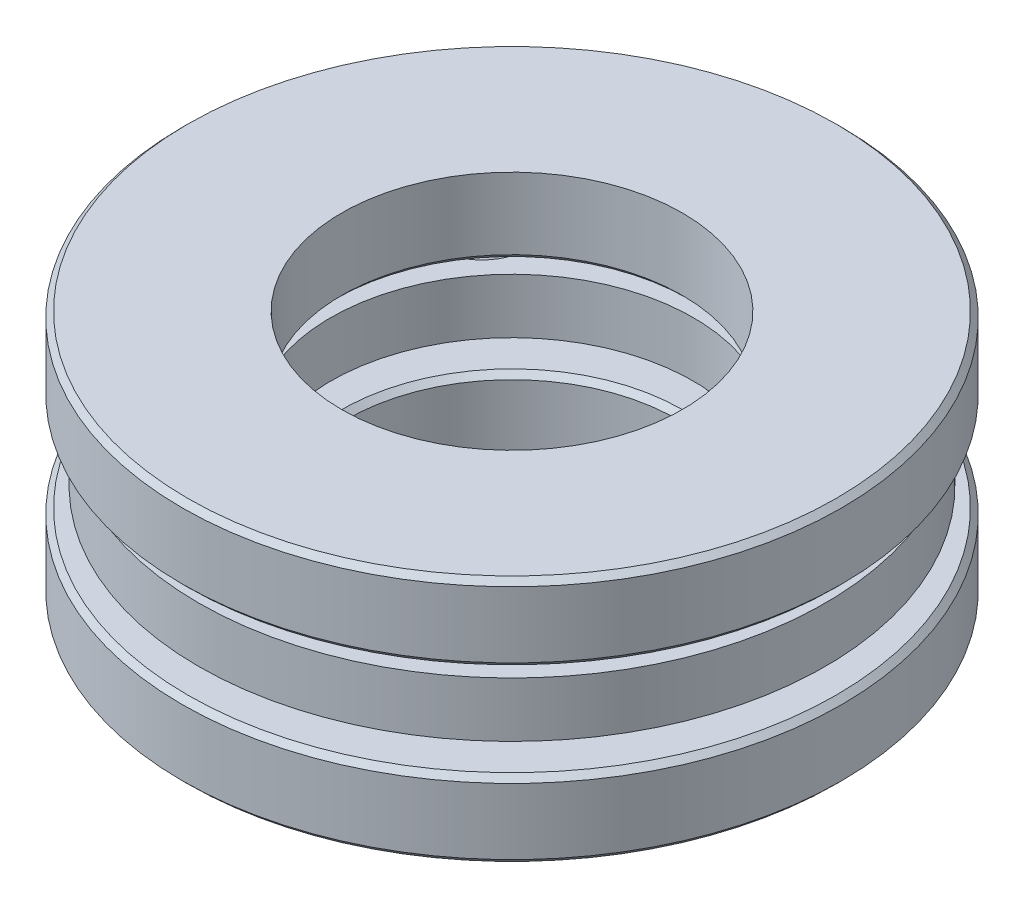
ISO-10303-21;
HEADER;
FILE_DESCRIPTION(('STEP AP214'),'2;1');
FILE_NAME('part.step','',(''),(''),'','','');
FILE_SCHEMA(('AUTOMOTIVE_DESIGN { 1 0 10303 214 1 1 1 1 }'));
ENDSEC;
DATA;
#1=APPLICATION_CONTEXT('core data for automotive mechanical design processes');
#2=APPLICATION_PROTOCOL_DEFINITION('international standard','automotive_design',2000,#1);
#3=PRODUCT_CONTEXT('',#1,'mechanical');
#4=PRODUCT('Part','Part','',(#3));
#5=PRODUCT_RELATED_PRODUCT_CATEGORY('part','',(#4));
#6=PRODUCT_DEFINITION_FORMATION('','',#4);
#7=PRODUCT_DEFINITION_CONTEXT('part definition',#1,'design');
#8=PRODUCT_DEFINITION('design','',#6,#7);
#9=PRODUCT_DEFINITION_SHAPE('','',#8);
#10=(LENGTH_UNIT() NAMED_UNIT(*) SI_UNIT(.MILLI.,.METRE.));
#11=(NAMED_UNIT(*) PLANE_ANGLE_UNIT() SI_UNIT($,.RADIAN.));
#12=(NAMED_UNIT(*) SI_UNIT($,.STERADIAN.) SOLID_ANGLE_UNIT());
#13=UNCERTAINTY_MEASURE_WITH_UNIT(LENGTH_MEASURE(1.E-05),#10,'distance_accuracy_value','');
#14=(GEOMETRIC_REPRESENTATION_CONTEXT(3) GLOBAL_UNCERTAINTY_ASSIGNED_CONTEXT((#13)) GLOBAL_UNIT_ASSIGNED_CONTEXT((#10,
#11,#12)) REPRESENTATION_CONTEXT('',''));
#15=CARTESIAN_POINT('',(0.,0.,0.));
#16=DIRECTION('',(0.,0.,1.));
#17=DIRECTION('',(1.,0.,0.));
#18=AXIS2_PLACEMENT_3D('',#15,#16,#17);
#19=CARTESIAN_POINT('',(-3.4471999940354,2.25,-2.89254424358943));
#20=DIRECTION('',(0.64278760968654,0.,-0.766044443118978));
#21=DIRECTION('',(-0.766044443118978,0.,-0.64278760968654));
#22=AXIS2_PLACEMENT_3D('',#19,#20,#21);
#23=SPHERICAL_SURFACE('',#22,1.);
#24=CARTESIAN_POINT('',(-3.4471999940354,2.25,-2.89254424358943));
#25=DIRECTION('',(0.,1.,0.));
#26=DIRECTION('',(-0.64278760968654,0.,0.766044443118977));
#27=AXIS2_PLACEMENT_3D('',#24,#25,#26);
#28=SPHERICAL_SURFACE('',#27,1.);
#29=CARTESIAN_POINT('',(-3.4471999940354,2.75,-2.89254424358943));
#30=DIRECTION('',(0.,1.,0.));
#31=DIRECTION('',(-0.642787609686541,0.,0.766044443118977));
#32=AXIS2_PLACEMENT_3D('',#29,#30,#31);
#33=CIRCLE('',#32,0.866025403784439);
#34=CARTESIAN_POINT('',(-4.00387039326182,2.75,-2.22913029542049));
#35=VERTEX_POINT('',#34);
#36=EDGE_CURVE('E91',#35,#35,#33,.T.);
#37=ORIENTED_EDGE('',*,*,#36,.T.);
#38=EDGE_LOOP('',(#37));
#39=FACE_BOUND('',#38,.T.);
#40=CARTESIAN_POINT('',(-3.4471999940354,3.1,-2.89254424358943));
#41=DIRECTION('',(0.,1.,0.));
#42=DIRECTION('',(0.,0.,1.));
#43=AXIS2_PLACEMENT_3D('',#40,#41,#42);
#44=CIRCLE('',#43,0.526782687642638);
#45=CARTESIAN_POINT('',(-3.4471999940354,3.1,-2.36576155594679));
#46=VERTEX_POINT('',#45);
#47=EDGE_CURVE('E145',#46,#46,#44,.T.);
#48=ORIENTED_EDGE('',*,*,#47,.F.);
#49=EDGE_LOOP('',(#48));
#50=FACE_BOUND('',#49,.T.);
#51=ADVANCED_FACE('F32',(#39,#50),#28,.T.);
#52=CARTESIAN_POINT('',(-0.781416799501173,2.25,-4.43163488855494));
#53=DIRECTION('',(0.984807753012208,0.,-0.173648177666928));
#54=DIRECTION('',(-0.173648177666928,0.,-0.984807753012208));
#55=AXIS2_PLACEMENT_3D('',#52,#53,#54);
#56=SPHERICAL_SURFACE('',#55,1.);
#57=CARTESIAN_POINT('',(-0.781416799501173,2.25,-4.43163488855494));
#58=DIRECTION('',(0.,1.,0.));
#59=DIRECTION('',(-0.984807753012209,0.,0.173648177666927));
#60=AXIS2_PLACEMENT_3D('',#57,#58,#59);
#61=SPHERICAL_SURFACE('',#60,1.);
#62=CARTESIAN_POINT('',(-0.781416799501173,2.75,-4.43163488855494));
#63=DIRECTION('',(0.,1.,0.));
#64=DIRECTION('',(-0.984807753012209,0.,0.173648177666927));
#65=AXIS2_PLACEMENT_3D('',#62,#63,#64);
#66=CIRCLE('',#65,0.866025403784439);
#67=CARTESIAN_POINT('',(-1.63428533145362,2.75,-4.28125115537451));
#68=VERTEX_POINT('',#67);
#69=EDGE_CURVE('E94',#68,#68,#66,.T.);
#70=ORIENTED_EDGE('',*,*,#69,.T.);
#71=EDGE_LOOP('',(#70));
#72=FACE_BOUND('',#71,.T.);
#73=CARTESIAN_POINT('',(-0.781416799501173,3.1,-4.43163488855494));
#74=DIRECTION('',(0.,1.,0.));
#75=DIRECTION('',(0.,0.,1.));
#76=AXIS2_PLACEMENT_3D('',#73,#74,#75);
#77=CIRCLE('',#76,0.526782687642638);
#78=CARTESIAN_POINT('',(-0.781416799501173,3.1,-3.9048522009123));
#79=VERTEX_POINT('',#78);
#80=EDGE_CURVE('E148',#79,#79,#77,.T.);
#81=ORIENTED_EDGE('',*,*,#80,.F.);
#82=EDGE_LOOP('',(#81));
#83=FACE_BOUND('',#82,.T.);
#84=ADVANCED_FACE('F223',(#72,#83),#61,.T.);
#85=CARTESIAN_POINT('',(2.25000000000002,2.25,-3.89711431702996));
#86=DIRECTION('',(0.866025403784437,0.,0.500000000000004));
#87=DIRECTION('',(0.500000000000004,0.,-0.866025403784437));
#88=AXIS2_PLACEMENT_3D('',#85,#86,#87);
#89=SPHERICAL_SURFACE('',#88,1.);
#90=CARTESIAN_POINT('',(2.25000000000002,2.25,-3.89711431702996));
#91=DIRECTION('',(0.,1.,0.));
#92=DIRECTION('',(-0.866025403784436,0.,-0.500000000000004));
#93=AXIS2_PLACEMENT_3D('',#90,#91,#92);
#94=SPHERICAL_SURFACE('',#93,1.);
#95=CARTESIAN_POINT('',(2.25000000000002,2.75,-3.89711431702996));
#96=DIRECTION('',(0.,1.,0.));
#97=DIRECTION('',(-0.866025403784436,0.,-0.500000000000004));
#98=AXIS2_PLACEMENT_3D('',#95,#96,#97);
#99=CIRCLE('',#98,0.866025403784439);
#100=CARTESIAN_POINT('',(1.50000000000002,2.75,-4.33012701892219));
#101=VERTEX_POINT('',#100);
#102=EDGE_CURVE('E102',#101,#101,#99,.T.);
#103=ORIENTED_EDGE('',*,*,#102,.T.);
#104=EDGE_LOOP('',(#103));
#105=FACE_BOUND('',#104,.T.);
#106=CARTESIAN_POINT('',(2.25000000000002,3.1,-3.89711431702996));
#107=DIRECTION('',(0.,1.,0.));
#108=DIRECTION('',(0.,0.,1.));
#109=AXIS2_PLACEMENT_3D('',#106,#107,#108);
#110=CIRCLE('',#109,0.526782687642638);
#111=CARTESIAN_POINT('',(2.25000000000002,3.1,-3.37033162938733));
#112=VERTEX_POINT('',#111);
#113=EDGE_CURVE('E151',#112,#112,#110,.T.);
#114=ORIENTED_EDGE('',*,*,#113,.F.);
#115=EDGE_LOOP('',(#114));
#116=FACE_BOUND('',#115,.T.);
#117=ADVANCED_FACE('F230',(#105,#116),#94,.T.);
#118=CARTESIAN_POINT('',(4.2286167935366,2.25,-1.53909064496548));
#119=DIRECTION('',(0.342020143325663,0.,0.939692620785911));
#120=DIRECTION('',(0.939692620785911,0.,-0.342020143325663));
#121=AXIS2_PLACEMENT_3D('',#118,#119,#120);
#122=SPHERICAL_SURFACE('',#121,1.);
#123=CARTESIAN_POINT('',(4.2286167935366,2.25,-1.53909064496548));
#124=DIRECTION('',(0.,1.,0.));
#125=DIRECTION('',(-0.342020143325663,0.,-0.93969262078591));
#126=AXIS2_PLACEMENT_3D('',#123,#124,#125);
#127=SPHERICAL_SURFACE('',#126,1.);
#128=CARTESIAN_POINT('',(4.2286167935366,2.75,-1.53909064496548));
#129=DIRECTION('',(0.,1.,0.));
#130=DIRECTION('',(-0.342020143325663,0.,-0.939692620785911));
#131=AXIS2_PLACEMENT_3D('',#128,#129,#130);
#132=CIRCLE('',#131,0.866025403784439);
#133=CARTESIAN_POINT('',(3.93241866081058,2.75,-2.35288832631486));
#134=VERTEX_POINT('',#133);
#135=EDGE_CURVE('E98',#134,#134,#132,.T.);
#136=ORIENTED_EDGE('',*,*,#135,.T.);
#137=EDGE_LOOP('',(#136));
#138=FACE_BOUND('',#137,.T.);
#139=CARTESIAN_POINT('',(4.2286167935366,3.1,-1.53909064496548));
#140=DIRECTION('',(0.,1.,0.));
#141=DIRECTION('',(0.,0.,1.));
#142=AXIS2_PLACEMENT_3D('',#139,#140,#141);
#143=CIRCLE('',#142,0.526782687642638);
#144=CARTESIAN_POINT('',(4.2286167935366,3.1,-1.01230795732285));
#145=VERTEX_POINT('',#144);
#146=EDGE_CURVE('E154',#145,#145,#143,.T.);
#147=ORIENTED_EDGE('',*,*,#146,.F.);
#148=EDGE_LOOP('',(#147));
#149=FACE_BOUND('',#148,.T.);
#150=ADVANCED_FACE('F331',(#138,#149),#127,.T.);
#151=CARTESIAN_POINT('',(4.22861679353658,2.25,1.53909064496554));
#152=DIRECTION('',(-0.342020143325675,0.,0.939692620785906));
#153=DIRECTION('',(0.939692620785906,0.,0.342020143325675));
#154=AXIS2_PLACEMENT_3D('',#151,#152,#153);
#155=SPHERICAL_SURFACE('',#154,1.);
#156=CARTESIAN_POINT('',(4.22861679353658,2.25,1.53909064496554));
#157=DIRECTION('',(0.,1.,0.));
#158=DIRECTION('',(0.342020143325676,0.,-0.939692620785906));
#159=AXIS2_PLACEMENT_3D('',#156,#157,#158);
#160=SPHERICAL_SURFACE('',#159,1.);
#161=CARTESIAN_POINT('',(4.22861679353658,2.75,1.53909064496554));
#162=DIRECTION('',(0.,1.,0.));
#163=DIRECTION('',(0.342020143325676,0.,-0.939692620785906));
#164=AXIS2_PLACEMENT_3D('',#161,#162,#163);
#165=CIRCLE('',#164,0.866025403784439);
#166=CARTESIAN_POINT('',(4.52481492626261,2.75,0.725292963616169));
#167=VERTEX_POINT('',#166);
#168=EDGE_CURVE('E95',#167,#167,#165,.T.);
#169=ORIENTED_EDGE('',*,*,#168,.T.);
#170=EDGE_LOOP('',(#169));
#171=FACE_BOUND('',#170,.T.);
#172=CARTESIAN_POINT('',(4.22861679353658,3.1,1.53909064496554));
#173=DIRECTION('',(0.,1.,0.));
#174=DIRECTION('',(0.,0.,1.));
#175=AXIS2_PLACEMENT_3D('',#172,#173,#174);
#176=CIRCLE('',#175,0.526782687642638);
#177=CARTESIAN_POINT('',(4.22861679353658,3.1,2.06587333260818));
#178=VERTEX_POINT('',#177);
#179=EDGE_CURVE('E157',#178,#178,#176,.T.);
#180=ORIENTED_EDGE('',*,*,#179,.F.);
#181=EDGE_LOOP('',(#180));
#182=FACE_BOUND('',#181,.T.);
#183=ADVANCED_FACE('F326',(#171,#182),#160,.T.);
#184=CARTESIAN_POINT('',(2.24999999999996,2.25,3.89711431702999));
#185=DIRECTION('',(-0.866025403784443,0.,0.499999999999992));
#186=DIRECTION('',(0.499999999999992,0.,0.866025403784443));
#187=AXIS2_PLACEMENT_3D('',#184,#185,#186);
#188=SPHERICAL_SURFACE('',#187,1.);
#189=CARTESIAN_POINT('',(2.24999999999996,2.25,3.89711431702999));
#190=DIRECTION('',(0.,1.,0.));
#191=DIRECTION('',(0.866025403784443,0.,-0.499999999999992));
#192=AXIS2_PLACEMENT_3D('',#189,#190,#191);
#193=SPHERICAL_SURFACE('',#192,1.);
#194=CARTESIAN_POINT('',(2.24999999999996,2.75,3.89711431702999));
#195=DIRECTION('',(0.,1.,0.));
#196=DIRECTION('',(0.866025403784443,0.,-0.499999999999992));
#197=AXIS2_PLACEMENT_3D('',#194,#195,#196);
#198=CIRCLE('',#197,0.866025403784439);
#199=CARTESIAN_POINT('',(2.99999999999997,2.75,3.46410161513778));
#200=VERTEX_POINT('',#199);
#201=EDGE_CURVE('E99',#200,#200,#198,.T.);
#202=ORIENTED_EDGE('',*,*,#201,.T.);
#203=EDGE_LOOP('',(#202));
#204=FACE_BOUND('',#203,.T.);
#205=CARTESIAN_POINT('',(2.24999999999996,3.1,3.89711431702999));
#206=DIRECTION('',(0.,1.,0.));
#207=DIRECTION('',(0.,0.,1.));
#208=AXIS2_PLACEMENT_3D('',#205,#206,#207);
#209=CIRCLE('',#208,0.526782687642638);
#210=CARTESIAN_POINT('',(2.24999999999996,3.1,4.42389700467263));
#211=VERTEX_POINT('',#210);
#212=EDGE_CURVE('E160',#211,#211,#209,.T.);
#213=ORIENTED_EDGE('',*,*,#212,.F.);
#214=EDGE_LOOP('',(#213));
#215=FACE_BOUND('',#214,.T.);
#216=ADVANCED_FACE('F321',(#204,#215),#193,.T.);
#217=CARTESIAN_POINT('',(-0.781416799501232,2.25,4.43163488855493));
#218=DIRECTION('',(-0.984807753012206,0.,-0.17364817766694));
#219=DIRECTION('',(-0.17364817766694,0.,0.984807753012206));
#220=AXIS2_PLACEMENT_3D('',#217,#218,#219);
#221=SPHERICAL_SURFACE('',#220,1.);
#222=CARTESIAN_POINT('',(-0.781416799501232,2.25,4.43163488855493));
#223=DIRECTION('',(0.,1.,0.));
#224=DIRECTION('',(0.984807753012206,0.,0.17364817766694));
#225=AXIS2_PLACEMENT_3D('',#222,#223,#224);
#226=SPHERICAL_SURFACE('',#225,1.);
#227=CARTESIAN_POINT('',(-0.781416799501232,2.75,4.43163488855493));
#228=DIRECTION('',(0.,1.,0.));
#229=DIRECTION('',(0.984807753012206,0.,0.17364817766694));
#230=AXIS2_PLACEMENT_3D('',#227,#228,#229);
#231=CIRCLE('',#230,0.866025403784439);
#232=CARTESIAN_POINT('',(0.0714517324512098,2.75,4.58201862173537));
#233=VERTEX_POINT('',#232);
#234=EDGE_CURVE('E110',#233,#233,#231,.T.);
#235=ORIENTED_EDGE('',*,*,#234,.T.);
#236=EDGE_LOOP('',(#235));
#237=FACE_BOUND('',#236,.T.);
#238=CARTESIAN_POINT('',(-0.781416799501232,3.1,4.43163488855493));
#239=DIRECTION('',(0.,1.,0.));
#240=DIRECTION('',(0.,0.,1.));
#241=AXIS2_PLACEMENT_3D('',#238,#239,#240);
#242=CIRCLE('',#241,0.526782687642638);
#243=CARTESIAN_POINT('',(-0.781416799501232,3.1,4.95841757619757));
#244=VERTEX_POINT('',#243);
#245=EDGE_CURVE('E163',#244,#244,#242,.T.);
#246=ORIENTED_EDGE('',*,*,#245,.F.);
#247=EDGE_LOOP('',(#246));
#248=FACE_BOUND('',#247,.T.);
#249=ADVANCED_FACE('F317',(#237,#248),#226,.T.);
#250=CARTESIAN_POINT('',(-3.44719999403544,2.25,2.89254424358939));
#251=DIRECTION('',(-0.64278760968653,0.,-0.766044443118986));
#252=DIRECTION('',(-0.766044443118986,0.,0.64278760968653));
#253=AXIS2_PLACEMENT_3D('',#250,#251,#252);
#254=SPHERICAL_SURFACE('',#253,1.);
#255=CARTESIAN_POINT('',(-3.44719999403544,2.25,2.89254424358939));
#256=DIRECTION('',(0.,1.,0.));
#257=DIRECTION('',(0.64278760968653,0.,0.766044443118986));
#258=AXIS2_PLACEMENT_3D('',#255,#256,#257);
#259=SPHERICAL_SURFACE('',#258,1.);
#260=CARTESIAN_POINT('',(-3.44719999403544,2.75,2.89254424358939));
#261=DIRECTION('',(0.,1.,0.));
#262=DIRECTION('',(0.64278760968653,0.,0.766044443118986));
#263=AXIS2_PLACEMENT_3D('',#260,#261,#262);
#264=CIRCLE('',#263,0.866025403784439);
#265=CARTESIAN_POINT('',(-2.89052959480903,2.75,3.55595819175833));
#266=VERTEX_POINT('',#265);
#267=EDGE_CURVE('E107',#266,#266,#264,.T.);
#268=ORIENTED_EDGE('',*,*,#267,.T.);
#269=EDGE_LOOP('',(#268));
#270=FACE_BOUND('',#269,.T.);
#271=CARTESIAN_POINT('',(-3.44719999403544,3.1,2.89254424358939));
#272=DIRECTION('',(0.,1.,0.));
#273=DIRECTION('',(0.,0.,1.));
#274=AXIS2_PLACEMENT_3D('',#271,#272,#273);
#275=CIRCLE('',#274,0.526782687642638);
#276=CARTESIAN_POINT('',(-3.44719999403544,3.1,3.41932693123202));
#277=VERTEX_POINT('',#276);
#278=EDGE_CURVE('E166',#277,#277,#275,.T.);
#279=ORIENTED_EDGE('',*,*,#278,.F.);
#280=EDGE_LOOP('',(#279));
#281=FACE_BOUND('',#280,.T.);
#282=ADVANCED_FACE('F314',(#270,#281),#259,.T.);
#283=CARTESIAN_POINT('',(0.,2.75,0.));
#284=DIRECTION('',(0.,1.,0.));
#285=DIRECTION('',(0.,0.,1.));
#286=AXIS2_PLACEMENT_3D('',#283,#284,#285);
#287=PLANE('',#286);
#288=ORIENTED_EDGE('',*,*,#69,.F.);
#289=EDGE_LOOP('',(#288));
#290=FACE_BOUND('',#289,.T.);
#291=ORIENTED_EDGE('',*,*,#102,.F.);
#292=EDGE_LOOP('',(#291));
#293=FACE_BOUND('',#292,.T.);
#294=ORIENTED_EDGE('',*,*,#135,.F.);
#295=EDGE_LOOP('',(#294));
#296=FACE_BOUND('',#295,.T.);
#297=ORIENTED_EDGE('',*,*,#168,.F.);
#298=EDGE_LOOP('',(#297));
#299=FACE_BOUND('',#298,.T.);
#300=ORIENTED_EDGE('',*,*,#201,.F.);
#301=EDGE_LOOP('',(#300));
#302=FACE_BOUND('',#301,.T.);
#303=ORIENTED_EDGE('',*,*,#234,.F.);
#304=EDGE_LOOP('',(#303));
#305=FACE_BOUND('',#304,.T.);
#306=ORIENTED_EDGE('',*,*,#267,.F.);
#307=EDGE_LOOP('',(#306));
#308=FACE_BOUND('',#307,.T.);
#309=ORIENTED_EDGE('',*,*,#36,.F.);
#310=EDGE_LOOP('',(#309));
#311=FACE_BOUND('',#310,.T.);
#312=CARTESIAN_POINT('',(-4.5,2.75,0.));
#313=DIRECTION('',(0.,1.,0.));
#314=DIRECTION('',(0.,0.,1.));
#315=AXIS2_PLACEMENT_3D('',#312,#313,#314);
#316=CIRCLE('',#315,0.866025403784439);
#317=CARTESIAN_POINT('',(-4.5,2.75,0.866025403784439));
#318=VERTEX_POINT('',#317);
#319=EDGE_CURVE('E86',#318,#318,#316,.T.);
#320=ORIENTED_EDGE('',*,*,#319,.F.);
#321=EDGE_LOOP('',(#320));
#322=FACE_BOUND('',#321,.T.);
#323=CARTESIAN_POINT('',(0.,2.75,0.));
#324=DIRECTION('',(0.,1.,0.));
#325=DIRECTION('',(0.,0.,1.));
#326=AXIS2_PLACEMENT_3D('',#323,#324,#325);
#327=CIRCLE('',#326,5.7);
#328=CARTESIAN_POINT('',(0.,2.75,5.7));
#329=VERTEX_POINT('',#328);
#330=EDGE_CURVE('E76',#329,#329,#327,.T.);
#331=ORIENTED_EDGE('',*,*,#330,.T.);
#332=EDGE_LOOP('',(#331));
#333=FACE_BOUND('',#332,.T.);
#334=CARTESIAN_POINT('',(0.,2.75,0.));
#335=DIRECTION('',(0.,1.,0.));
#336=DIRECTION('',(0.,0.,1.));
#337=AXIS2_PLACEMENT_3D('',#334,#335,#336);
#338=CIRCLE('',#337,3.3);
#339=CARTESIAN_POINT('',(0.,2.75,3.3));
#340=VERTEX_POINT('',#339);
#341=EDGE_CURVE('E80',#340,#340,#338,.T.);
#342=ORIENTED_EDGE('',*,*,#341,.F.);
#343=EDGE_LOOP('',(#342));
#344=FACE_BOUND('',#343,.T.);
#345=ADVANCED_FACE('F254',(#290,#293,#296,#299,#302,#305,#308,#311,#322,#333,#344),#287,.T.);
#346=CARTESIAN_POINT('',(0.,1.75,0.));
#347=DIRECTION('',(0.,1.,0.));
#348=DIRECTION('',(0.,0.,1.));
#349=AXIS2_PLACEMENT_3D('',#346,#347,#348);
#350=PLANE('',#349);
#351=CARTESIAN_POINT('',(-0.781416799501173,1.75,-4.43163488855494));
#352=DIRECTION('',(0.,1.,0.));
#353=DIRECTION('',(0.,0.,1.));
#354=AXIS2_PLACEMENT_3D('',#351,#352,#353);
#355=CIRCLE('',#354,0.866025403784439);
#356=CARTESIAN_POINT('',(-0.781416799501173,1.75,-3.5656094847705));
#357=VERTEX_POINT('',#356);
#358=EDGE_CURVE('E118',#357,#357,#355,.T.);
#359=ORIENTED_EDGE('',*,*,#358,.T.);
#360=EDGE_LOOP('',(#359));
#361=FACE_BOUND('',#360,.T.);
#362=CARTESIAN_POINT('',(2.25000000000002,1.75,-3.89711431702996));
#363=DIRECTION('',(0.,1.,0.));
#364=DIRECTION('',(0.,0.,1.));
#365=AXIS2_PLACEMENT_3D('',#362,#363,#364);
#366=CIRCLE('',#365,0.866025403784439);
#367=CARTESIAN_POINT('',(2.25000000000002,1.75,-3.03108891324553));
#368=VERTEX_POINT('',#367);
#369=EDGE_CURVE('E121',#368,#368,#366,.T.);
#370=ORIENTED_EDGE('',*,*,#369,.T.);
#371=EDGE_LOOP('',(#370));
#372=FACE_BOUND('',#371,.T.);
#373=CARTESIAN_POINT('',(4.2286167935366,1.75,-1.53909064496548));
#374=DIRECTION('',(0.,1.,0.));
#375=DIRECTION('',(0.,0.,1.));
#376=AXIS2_PLACEMENT_3D('',#373,#374,#375);
#377=CIRCLE('',#376,0.866025403784439);
#378=CARTESIAN_POINT('',(4.2286167935366,1.75,-0.673065241181045));
#379=VERTEX_POINT('',#378);
#380=EDGE_CURVE('E124',#379,#379,#377,.T.);
#381=ORIENTED_EDGE('',*,*,#380,.T.);
#382=EDGE_LOOP('',(#381));
#383=FACE_BOUND('',#382,.T.);
#384=CARTESIAN_POINT('',(4.22861679353658,1.75,1.53909064496554));
#385=DIRECTION('',(0.,1.,0.));
#386=DIRECTION('',(0.,0.,1.));
#387=AXIS2_PLACEMENT_3D('',#384,#385,#386);
#388=CIRCLE('',#387,0.866025403784439);
#389=CARTESIAN_POINT('',(4.22861679353658,1.75,2.40511604874998));
#390=VERTEX_POINT('',#389);
#391=EDGE_CURVE('E127',#390,#390,#388,.T.);
#392=ORIENTED_EDGE('',*,*,#391,.T.);
#393=EDGE_LOOP('',(#392));
#394=FACE_BOUND('',#393,.T.);
#395=CARTESIAN_POINT('',(2.24999999999996,1.75,3.89711431702999));
#396=DIRECTION('',(0.,1.,0.));
#397=DIRECTION('',(0.,0.,1.));
#398=AXIS2_PLACEMENT_3D('',#395,#396,#397);
#399=CIRCLE('',#398,0.866025403784439);
#400=CARTESIAN_POINT('',(2.24999999999996,1.75,4.76313972081443));
#401=VERTEX_POINT('',#400);
#402=EDGE_CURVE('E130',#401,#401,#399,.T.);
#403=ORIENTED_EDGE('',*,*,#402,.T.);
#404=EDGE_LOOP('',(#403));
#405=FACE_BOUND('',#404,.T.);
#406=CARTESIAN_POINT('',(-0.781416799501232,1.75,4.43163488855493));
#407=DIRECTION('',(0.,1.,0.));
#408=DIRECTION('',(0.,0.,1.));
#409=AXIS2_PLACEMENT_3D('',#406,#407,#408);
#410=CIRCLE('',#409,0.866025403784439);
#411=CARTESIAN_POINT('',(-0.781416799501232,1.75,5.29766029233937));
#412=VERTEX_POINT('',#411);
#413=EDGE_CURVE('E133',#412,#412,#410,.T.);
#414=ORIENTED_EDGE('',*,*,#413,.T.);
#415=EDGE_LOOP('',(#414));
#416=FACE_BOUND('',#415,.T.);
#417=CARTESIAN_POINT('',(-3.44719999403544,1.75,2.89254424358939));
#418=DIRECTION('',(0.,1.,0.));
#419=DIRECTION('',(0.,0.,1.));
#420=AXIS2_PLACEMENT_3D('',#417,#418,#419);
#421=CIRCLE('',#420,0.866025403784439);
#422=CARTESIAN_POINT('',(-3.44719999403544,1.75,3.75856964737382));
#423=VERTEX_POINT('',#422);
#424=EDGE_CURVE('E136',#423,#423,#421,.T.);
#425=ORIENTED_EDGE('',*,*,#424,.T.);
#426=EDGE_LOOP('',(#425));
#427=FACE_BOUND('',#426,.T.);
#428=CARTESIAN_POINT('',(-3.4471999940354,1.75,-2.89254424358943));
#429=DIRECTION('',(0.,1.,0.));
#430=DIRECTION('',(0.,0.,1.));
#431=AXIS2_PLACEMENT_3D('',#428,#429,#430);
#432=CIRCLE('',#431,0.866025403784439);
#433=CARTESIAN_POINT('',(-3.4471999940354,1.75,-2.02651883980499));
#434=VERTEX_POINT('',#433);
#435=EDGE_CURVE('E111',#434,#434,#432,.T.);
#436=ORIENTED_EDGE('',*,*,#435,.T.);
#437=EDGE_LOOP('',(#436));
#438=FACE_BOUND('',#437,.T.);
#439=CARTESIAN_POINT('',(-4.5,1.75,0.));
#440=DIRECTION('',(0.,1.,0.));
#441=DIRECTION('',(0.,0.,1.));
#442=AXIS2_PLACEMENT_3D('',#439,#440,#441);
#443=CIRCLE('',#442,0.866025403784439);
#444=CARTESIAN_POINT('',(-4.5,1.75,0.866025403784439));
#445=VERTEX_POINT('',#444);
#446=EDGE_CURVE('E139',#445,#445,#443,.T.);
#447=ORIENTED_EDGE('',*,*,#446,.T.);
#448=EDGE_LOOP('',(#447));
#449=FACE_BOUND('',#448,.T.);
#450=CARTESIAN_POINT('',(0.,1.75,0.));
#451=DIRECTION('',(0.,1.,0.));
#452=DIRECTION('',(0.,0.,1.));
#453=AXIS2_PLACEMENT_3D('',#450,#451,#452);
#454=CIRCLE('',#453,5.7);
#455=CARTESIAN_POINT('',(0.,1.75,5.7));
#456=VERTEX_POINT('',#455);
#457=EDGE_CURVE('E77',#456,#456,#454,.T.);
#458=ORIENTED_EDGE('',*,*,#457,.F.);
#459=EDGE_LOOP('',(#458));
#460=FACE_BOUND('',#459,.T.);
#461=CARTESIAN_POINT('',(0.,1.75,0.));
#462=DIRECTION('',(0.,1.,0.));
#463=DIRECTION('',(0.,0.,1.));
#464=AXIS2_PLACEMENT_3D('',#461,#462,#463);
#465=CIRCLE('',#464,3.3);
#466=CARTESIAN_POINT('',(0.,1.75,3.3));
#467=VERTEX_POINT('',#466);
#468=EDGE_CURVE('E83',#467,#467,#465,.T.);
#469=ORIENTED_EDGE('',*,*,#468,.T.);
#470=EDGE_LOOP('',(#469));
#471=FACE_BOUND('',#470,.T.);
#472=ADVANCED_FACE('F251',(#361,#372,#383,#394,#405,#416,#427,#438,#449,#460,#471),#350,.F.);
#473=CARTESIAN_POINT('',(0.,2.75,0.));
#474=DIRECTION('',(0.,-1.,0.));
#475=DIRECTION('',(0.,0.,-1.));
#476=AXIS2_PLACEMENT_3D('',#473,#474,#475);
#477=CYLINDRICAL_SURFACE('',#476,5.7);
#478=ORIENTED_EDGE('',*,*,#330,.F.);
#479=EDGE_LOOP('',(#478));
#480=FACE_BOUND('',#479,.T.);
#481=ORIENTED_EDGE('',*,*,#457,.T.);
#482=EDGE_LOOP('',(#481));
#483=FACE_BOUND('',#482,.T.);
#484=ADVANCED_FACE('F245',(#480,#483),#477,.T.);
#485=CARTESIAN_POINT('',(0.,2.75,0.));
#486=DIRECTION('',(0.,-1.,0.));
#487=DIRECTION('',(0.,0.,-1.));
#488=AXIS2_PLACEMENT_3D('',#485,#486,#487);
#489=CYLINDRICAL_SURFACE('',#488,3.3);
#490=ORIENTED_EDGE('',*,*,#341,.T.);
#491=EDGE_LOOP('',(#490));
#492=FACE_BOUND('',#491,.T.);
#493=ORIENTED_EDGE('',*,*,#468,.F.);
#494=EDGE_LOOP('',(#493));
#495=FACE_BOUND('',#494,.T.);
#496=ADVANCED_FACE('F237',(#492,#495),#489,.F.);
#497=CARTESIAN_POINT('',(-3.4471999940354,2.25,-2.89254424358943));
#498=DIRECTION('',(0.,1.,0.));
#499=DIRECTION('',(0.,0.,1.));
#500=AXIS2_PLACEMENT_3D('',#497,#498,#499);
#501=SPHERICAL_SURFACE('',#500,1.);
#502=CARTESIAN_POINT('',(-3.4471999940354,1.4,-2.89254424358943));
#503=DIRECTION('',(0.,1.,0.));
#504=DIRECTION('',(0.,0.,1.));
#505=AXIS2_PLACEMENT_3D('',#502,#503,#504);
#506=CIRCLE('',#505,0.526782687642637);
#507=CARTESIAN_POINT('',(-3.4471999940354,1.4,-2.3657615559468));
#508=VERTEX_POINT('',#507);
#509=EDGE_CURVE('E193',#508,#508,#506,.T.);
#510=ORIENTED_EDGE('',*,*,#509,.T.);
#511=EDGE_LOOP('',(#510));
#512=FACE_BOUND('',#511,.T.);
#513=ORIENTED_EDGE('',*,*,#435,.F.);
#514=EDGE_LOOP('',(#513));
#515=FACE_BOUND('',#514,.T.);
#516=ADVANCED_FACE('F226',(#512,#515),#501,.T.);
#517=CARTESIAN_POINT('',(-0.781416799501173,2.25,-4.43163488855494));
#518=DIRECTION('',(0.,1.,0.));
#519=DIRECTION('',(0.,0.,1.));
#520=AXIS2_PLACEMENT_3D('',#517,#518,#519);
#521=SPHERICAL_SURFACE('',#520,1.);
#522=CARTESIAN_POINT('',(-0.781416799501173,1.4,-4.43163488855494));
#523=DIRECTION('',(0.,1.,0.));
#524=DIRECTION('',(0.,0.,1.));
#525=AXIS2_PLACEMENT_3D('',#522,#523,#524);
#526=CIRCLE('',#525,0.526782687642637);
#527=CARTESIAN_POINT('',(-0.781416799501173,1.4,-3.9048522009123));
#528=VERTEX_POINT('',#527);
#529=EDGE_CURVE('E190',#528,#528,#526,.T.);
#530=ORIENTED_EDGE('',*,*,#529,.T.);
#531=EDGE_LOOP('',(#530));
#532=FACE_BOUND('',#531,.T.);
#533=ORIENTED_EDGE('',*,*,#358,.F.);
#534=EDGE_LOOP('',(#533));
#535=FACE_BOUND('',#534,.T.);
#536=ADVANCED_FACE('F233',(#532,#535),#521,.T.);
#537=CARTESIAN_POINT('',(2.25000000000002,2.25,-3.89711431702996));
#538=DIRECTION('',(0.,1.,0.));
#539=DIRECTION('',(0.,0.,1.));
#540=AXIS2_PLACEMENT_3D('',#537,#538,#539);
#541=SPHERICAL_SURFACE('',#540,1.);
#542=CARTESIAN_POINT('',(2.25000000000002,1.4,-3.89711431702996));
#543=DIRECTION('',(0.,1.,0.));
#544=DIRECTION('',(0.,0.,1.));
#545=AXIS2_PLACEMENT_3D('',#542,#543,#544);
#546=CIRCLE('',#545,0.526782687642637);
#547=CARTESIAN_POINT('',(2.25000000000002,1.4,-3.37033162938733));
#548=VERTEX_POINT('',#547);
#549=EDGE_CURVE('E187',#548,#548,#546,.T.);
#550=ORIENTED_EDGE('',*,*,#549,.T.);
#551=EDGE_LOOP('',(#550));
#552=FACE_BOUND('',#551,.T.);
#553=ORIENTED_EDGE('',*,*,#369,.F.);
#554=EDGE_LOOP('',(#553));
#555=FACE_BOUND('',#554,.T.);
#556=ADVANCED_FACE('F243',(#552,#555),#541,.T.);
#557=CARTESIAN_POINT('',(4.2286167935366,2.25,-1.53909064496548));
#558=DIRECTION('',(0.,1.,0.));
#559=DIRECTION('',(0.,0.,1.));
#560=AXIS2_PLACEMENT_3D('',#557,#558,#559);
#561=SPHERICAL_SURFACE('',#560,1.);
#562=CARTESIAN_POINT('',(4.2286167935366,1.4,-1.53909064496548));
#563=DIRECTION('',(0.,1.,0.));
#564=DIRECTION('',(0.,0.,1.));
#565=AXIS2_PLACEMENT_3D('',#562,#563,#564);
#566=CIRCLE('',#565,0.526782687642637);
#567=CARTESIAN_POINT('',(4.2286167935366,1.4,-1.01230795732285));
#568=VERTEX_POINT('',#567);
#569=EDGE_CURVE('E184',#568,#568,#566,.T.);
#570=ORIENTED_EDGE('',*,*,#569,.T.);
#571=EDGE_LOOP('',(#570));
#572=FACE_BOUND('',#571,.T.);
#573=ORIENTED_EDGE('',*,*,#380,.F.);
#574=EDGE_LOOP('',(#573));
#575=FACE_BOUND('',#574,.T.);
#576=ADVANCED_FACE('F337',(#572,#575),#561,.T.);
#577=CARTESIAN_POINT('',(4.22861679353658,2.25,1.53909064496554));
#578=DIRECTION('',(0.,1.,0.));
#579=DIRECTION('',(0.,0.,1.));
#580=AXIS2_PLACEMENT_3D('',#577,#578,#579);
#581=SPHERICAL_SURFACE('',#580,1.);
#582=CARTESIAN_POINT('',(4.22861679353658,1.4,1.53909064496554));
#583=DIRECTION('',(0.,1.,0.));
#584=DIRECTION('',(0.,0.,1.));
#585=AXIS2_PLACEMENT_3D('',#582,#583,#584);
#586=CIRCLE('',#585,0.526782687642637);
#587=CARTESIAN_POINT('',(4.22861679353658,1.4,2.06587333260818));
#588=VERTEX_POINT('',#587);
#589=EDGE_CURVE('E181',#588,#588,#586,.T.);
#590=ORIENTED_EDGE('',*,*,#589,.T.);
#591=EDGE_LOOP('',(#590));
#592=FACE_BOUND('',#591,.T.);
#593=ORIENTED_EDGE('',*,*,#391,.F.);
#594=EDGE_LOOP('',(#593));
#595=FACE_BOUND('',#594,.T.);
#596=ADVANCED_FACE('F333',(#592,#595),#581,.T.);
#597=CARTESIAN_POINT('',(2.24999999999996,2.25,3.89711431702999));
#598=DIRECTION('',(0.,1.,0.));
#599=DIRECTION('',(0.,0.,1.));
#600=AXIS2_PLACEMENT_3D('',#597,#598,#599);
#601=SPHERICAL_SURFACE('',#600,1.);
#602=CARTESIAN_POINT('',(2.24999999999996,1.4,3.89711431702999));
#603=DIRECTION('',(0.,1.,0.));
#604=DIRECTION('',(0.,0.,1.));
#605=AXIS2_PLACEMENT_3D('',#602,#603,#604);
#606=CIRCLE('',#605,0.526782687642637);
#607=CARTESIAN_POINT('',(2.24999999999996,1.4,4.42389700467263));
#608=VERTEX_POINT('',#607);
#609=EDGE_CURVE('E178',#608,#608,#606,.T.);
#610=ORIENTED_EDGE('',*,*,#609,.T.);
#611=EDGE_LOOP('',(#610));
#612=FACE_BOUND('',#611,.T.);
#613=ORIENTED_EDGE('',*,*,#402,.F.);
#614=EDGE_LOOP('',(#613));
#615=FACE_BOUND('',#614,.T.);
#616=ADVANCED_FACE('F328',(#612,#615),#601,.T.);
#617=CARTESIAN_POINT('',(-0.781416799501232,2.25,4.43163488855493));
#618=DIRECTION('',(0.,1.,0.));
#619=DIRECTION('',(0.,0.,1.));
#620=AXIS2_PLACEMENT_3D('',#617,#618,#619);
#621=SPHERICAL_SURFACE('',#620,1.);
#622=CARTESIAN_POINT('',(-0.781416799501232,1.4,4.43163488855493));
#623=DIRECTION('',(0.,1.,0.));
#624=DIRECTION('',(0.,0.,1.));
#625=AXIS2_PLACEMENT_3D('',#622,#623,#624);
#626=CIRCLE('',#625,0.526782687642637);
#627=CARTESIAN_POINT('',(-0.781416799501232,1.4,4.95841757619757));
#628=VERTEX_POINT('',#627);
#629=EDGE_CURVE('E175',#628,#628,#626,.T.);
#630=ORIENTED_EDGE('',*,*,#629,.T.);
#631=EDGE_LOOP('',(#630));
#632=FACE_BOUND('',#631,.T.);
#633=ORIENTED_EDGE('',*,*,#413,.F.);
#634=EDGE_LOOP('',(#633));
#635=FACE_BOUND('',#634,.T.);
#636=ADVANCED_FACE('F323',(#632,#635),#621,.T.);
#637=CARTESIAN_POINT('',(-3.44719999403544,2.25,2.89254424358939));
#638=DIRECTION('',(0.,1.,0.));
#639=DIRECTION('',(0.,0.,1.));
#640=AXIS2_PLACEMENT_3D('',#637,#638,#639);
#641=SPHERICAL_SURFACE('',#640,1.);
#642=CARTESIAN_POINT('',(-3.44719999403544,1.4,2.89254424358939));
#643=DIRECTION('',(0.,1.,0.));
#644=DIRECTION('',(0.,0.,1.));
#645=AXIS2_PLACEMENT_3D('',#642,#643,#644);
#646=CIRCLE('',#645,0.526782687642637);
#647=CARTESIAN_POINT('',(-3.44719999403544,1.4,3.41932693123202));
#648=VERTEX_POINT('',#647);
#649=EDGE_CURVE('E172',#648,#648,#646,.T.);
#650=ORIENTED_EDGE('',*,*,#649,.T.);
#651=EDGE_LOOP('',(#650));
#652=FACE_BOUND('',#651,.T.);
#653=ORIENTED_EDGE('',*,*,#424,.F.);
#654=EDGE_LOOP('',(#653));
#655=FACE_BOUND('',#654,.T.);
#656=ADVANCED_FACE('F310',(#652,#655),#641,.T.);
#657=CARTESIAN_POINT('',(0.,4.5,0.));
#658=DIRECTION('',(0.,1.,0.));
#659=DIRECTION('',(0.,0.,1.));
#660=AXIS2_PLACEMENT_3D('',#657,#658,#659);
#661=PLANE('',#660);
#662=CARTESIAN_POINT('',(0.,4.5,0.));
#663=DIRECTION('',(0.,1.,0.));
#664=DIRECTION('',(0.,0.,1.));
#665=AXIS2_PLACEMENT_3D('',#662,#663,#664);
#666=CIRCLE('',#665,5.9);
#667=CARTESIAN_POINT('',(0.,4.5,5.9));
#668=VERTEX_POINT('',#667);
#669=EDGE_CURVE('E10',#668,#668,#666,.T.);
#670=ORIENTED_EDGE('',*,*,#669,.T.);
#671=EDGE_LOOP('',(#670));
#672=FACE_BOUND('',#671,.T.);
#673=CARTESIAN_POINT('',(0.,4.5,0.));
#674=DIRECTION('',(0.,1.,0.));
#675=DIRECTION('',(0.,0.,1.));
#676=AXIS2_PLACEMENT_3D('',#673,#674,#675);
#677=CIRCLE('',#676,3.1);
#678=CARTESIAN_POINT('',(0.,4.5,3.1));
#679=VERTEX_POINT('',#678);
#680=EDGE_CURVE('E142',#679,#679,#677,.T.);
#681=ORIENTED_EDGE('',*,*,#680,.F.);
#682=EDGE_LOOP('',(#681));
#683=FACE_BOUND('',#682,.T.);
#684=ADVANCED_FACE('F300',(#672,#683),#661,.T.);
#685=CARTESIAN_POINT('',(0.,3.1,0.));
#686=DIRECTION('',(0.,1.,0.));
#687=DIRECTION('',(0.,0.,1.));
#688=AXIS2_PLACEMENT_3D('',#685,#686,#687);
#689=CYLINDRICAL_SURFACE('',#688,6.);
#690=CARTESIAN_POINT('',(0.,3.2,0.));
#691=DIRECTION('',(0.,1.,0.));
#692=DIRECTION('',(0.,0.,1.));
#693=AXIS2_PLACEMENT_3D('',#690,#691,#692);
#694=CIRCLE('',#693,6.);
#695=CARTESIAN_POINT('',(0.,3.2,6.));
#696=VERTEX_POINT('',#695);
#697=EDGE_CURVE('E43',#696,#696,#694,.T.);
#698=ORIENTED_EDGE('',*,*,#697,.T.);
#699=EDGE_LOOP('',(#698));
#700=FACE_BOUND('',#699,.T.);
#701=CARTESIAN_POINT('',(0.,4.4,0.));
#702=DIRECTION('',(0.,1.,0.));
#703=DIRECTION('',(0.,0.,1.));
#704=AXIS2_PLACEMENT_3D('',#701,#702,#703);
#705=CIRCLE('',#704,6.);
#706=CARTESIAN_POINT('',(0.,4.4,6.));
#707=VERTEX_POINT('',#706);
#708=EDGE_CURVE('E47',#707,#707,#705,.F.);
#709=ORIENTED_EDGE('',*,*,#708,.T.);
#710=EDGE_LOOP('',(#709));
#711=FACE_BOUND('',#710,.T.);
#712=ADVANCED_FACE('F297',(#700,#711),#689,.T.);
#713=CARTESIAN_POINT('',(0.,3.1,0.));
#714=DIRECTION('',(0.,1.,0.));
#715=DIRECTION('',(0.,0.,1.));
#716=AXIS2_PLACEMENT_3D('',#713,#714,#715);
#717=CYLINDRICAL_SURFACE('',#716,3.1);
#718=CARTESIAN_POINT('',(0.,3.2,0.));
#719=DIRECTION('',(0.,1.,0.));
#720=DIRECTION('',(0.,0.,1.));
#721=AXIS2_PLACEMENT_3D('',#718,#719,#720);
#722=CIRCLE('',#721,3.1);
#723=CARTESIAN_POINT('',(0.,3.2,3.1));
#724=VERTEX_POINT('',#723);
#725=EDGE_CURVE('E58',#724,#724,#722,.F.);
#726=ORIENTED_EDGE('',*,*,#725,.T.);
#727=EDGE_LOOP('',(#726));
#728=FACE_BOUND('',#727,.T.);
#729=ORIENTED_EDGE('',*,*,#680,.T.);
#730=EDGE_LOOP('',(#729));
#731=FACE_BOUND('',#730,.T.);
#732=ADVANCED_FACE('F299',(#728,#731),#717,.F.);
#733=CARTESIAN_POINT('',(0.,3.1,0.));
#734=DIRECTION('',(0.,1.,0.));
#735=DIRECTION('',(0.,0.,1.));
#736=AXIS2_PLACEMENT_3D('',#733,#734,#735);
#737=PLANE('',#736);
#738=CARTESIAN_POINT('',(0.,3.1,0.));
#739=DIRECTION('',(0.,1.,0.));
#740=DIRECTION('',(0.,0.,1.));
#741=AXIS2_PLACEMENT_3D('',#738,#739,#740);
#742=CIRCLE('',#741,3.2);
#743=CARTESIAN_POINT('',(0.,3.1,3.2));
#744=VERTEX_POINT('',#743);
#745=EDGE_CURVE('E61',#744,#744,#742,.T.);
#746=ORIENTED_EDGE('',*,*,#745,.T.);
#747=EDGE_LOOP('',(#746));
#748=FACE_BOUND('',#747,.T.);
#749=CARTESIAN_POINT('',(0.,3.1,0.));
#750=DIRECTION('',(0.,1.,0.));
#751=DIRECTION('',(0.,0.,1.));
#752=AXIS2_PLACEMENT_3D('',#749,#750,#751);
#753=CIRCLE('',#752,5.9);
#754=CARTESIAN_POINT('',(0.,3.1,5.9));
#755=VERTEX_POINT('',#754);
#756=EDGE_CURVE('E64',#755,#755,#753,.F.);
#757=ORIENTED_EDGE('',*,*,#756,.T.);
#758=EDGE_LOOP('',(#757));
#759=FACE_BOUND('',#758,.T.);
#760=ORIENTED_EDGE('',*,*,#278,.T.);
#761=EDGE_LOOP('',(#760));
#762=FACE_BOUND('',#761,.T.);
#763=ORIENTED_EDGE('',*,*,#245,.T.);
#764=EDGE_LOOP('',(#763));
#765=FACE_BOUND('',#764,.T.);
#766=ORIENTED_EDGE('',*,*,#212,.T.);
#767=EDGE_LOOP('',(#766));
#768=FACE_BOUND('',#767,.T.);
#769=ORIENTED_EDGE('',*,*,#179,.T.);
#770=EDGE_LOOP('',(#769));
#771=FACE_BOUND('',#770,.T.);
#772=ORIENTED_EDGE('',*,*,#146,.T.);
#773=EDGE_LOOP('',(#772));
#774=FACE_BOUND('',#773,.T.);
#775=ORIENTED_EDGE('',*,*,#113,.T.);
#776=EDGE_LOOP('',(#775));
#777=FACE_BOUND('',#776,.T.);
#778=ORIENTED_EDGE('',*,*,#80,.T.);
#779=EDGE_LOOP('',(#778));
#780=FACE_BOUND('',#779,.T.);
#781=ORIENTED_EDGE('',*,*,#47,.T.);
#782=EDGE_LOOP('',(#781));
#783=FACE_BOUND('',#782,.T.);
#784=CARTESIAN_POINT('',(-4.5,3.1,0.));
#785=DIRECTION('',(0.,1.,0.));
#786=DIRECTION('',(0.,0.,1.));
#787=AXIS2_PLACEMENT_3D('',#784,#785,#786);
#788=CIRCLE('',#787,0.526782687642638);
#789=CARTESIAN_POINT('',(-4.5,3.1,0.526782687642638));
#790=VERTEX_POINT('',#789);
#791=EDGE_CURVE('E169',#790,#790,#788,.T.);
#792=ORIENTED_EDGE('',*,*,#791,.T.);
#793=EDGE_LOOP('',(#792));
#794=FACE_BOUND('',#793,.T.);
#795=ADVANCED_FACE('F307',(#748,#759,#762,#765,#768,#771,#774,#777,#780,#783,#794),#737,.F.);
#796=CARTESIAN_POINT('',(-4.5,2.25,0.));
#797=DIRECTION('',(0.,0.,-1.));
#798=DIRECTION('',(-1.,0.,0.));
#799=AXIS2_PLACEMENT_3D('',#796,#797,#798);
#800=SPHERICAL_SURFACE('',#799,1.);
#801=CARTESIAN_POINT('',(-4.5,2.25,0.));
#802=DIRECTION('',(0.,1.,0.));
#803=DIRECTION('',(0.,0.,1.));
#804=AXIS2_PLACEMENT_3D('',#801,#802,#803);
#805=SPHERICAL_SURFACE('',#804,1.);
#806=ORIENTED_EDGE('',*,*,#319,.T.);
#807=EDGE_LOOP('',(#806));
#808=FACE_BOUND('',#807,.T.);
#809=ORIENTED_EDGE('',*,*,#791,.F.);
#810=EDGE_LOOP('',(#809));
#811=FACE_BOUND('',#810,.T.);
#812=ADVANCED_FACE('F393',(#808,#811),#805,.T.);
#813=CARTESIAN_POINT('',(-4.5,2.25,0.));
#814=DIRECTION('',(0.,1.,0.));
#815=DIRECTION('',(0.,0.,1.));
#816=AXIS2_PLACEMENT_3D('',#813,#814,#815);
#817=SPHERICAL_SURFACE('',#816,1.);
#818=CARTESIAN_POINT('',(-4.5,1.4,0.));
#819=DIRECTION('',(0.,1.,0.));
#820=DIRECTION('',(0.,0.,1.));
#821=AXIS2_PLACEMENT_3D('',#818,#819,#820);
#822=CIRCLE('',#821,0.526782687642637);
#823=CARTESIAN_POINT('',(-4.5,1.4,0.526782687642637));
#824=VERTEX_POINT('',#823);
#825=EDGE_CURVE('E197',#824,#824,#822,.T.);
#826=ORIENTED_EDGE('',*,*,#825,.T.);
#827=EDGE_LOOP('',(#826));
#828=FACE_BOUND('',#827,.T.);
#829=ORIENTED_EDGE('',*,*,#446,.F.);
#830=EDGE_LOOP('',(#829));
#831=FACE_BOUND('',#830,.T.);
#832=ADVANCED_FACE('F375',(#828,#831),#817,.T.);
#833=CARTESIAN_POINT('',(0.,1.4,0.));
#834=DIRECTION('',(0.,1.,0.));
#835=DIRECTION('',(0.,0.,1.));
#836=AXIS2_PLACEMENT_3D('',#833,#834,#835);
#837=PLANE('',#836);
#838=CARTESIAN_POINT('',(0.,1.4,0.));
#839=DIRECTION('',(0.,1.,0.));
#840=DIRECTION('',(0.,0.,1.));
#841=AXIS2_PLACEMENT_3D('',#838,#839,#840);
#842=CIRCLE('',#841,3.1);
#843=CARTESIAN_POINT('',(0.,1.4,3.1));
#844=VERTEX_POINT('',#843);
#845=EDGE_CURVE('E67',#844,#844,#842,.F.);
#846=ORIENTED_EDGE('',*,*,#845,.T.);
#847=EDGE_LOOP('',(#846));
#848=FACE_BOUND('',#847,.T.);
#849=CARTESIAN_POINT('',(0.,1.4,0.));
#850=DIRECTION('',(0.,1.,0.));
#851=DIRECTION('',(0.,0.,1.));
#852=AXIS2_PLACEMENT_3D('',#849,#850,#851);
#853=CIRCLE('',#852,5.9);
#854=CARTESIAN_POINT('',(0.,1.4,5.9));
#855=VERTEX_POINT('',#854);
#856=EDGE_CURVE('E70',#855,#855,#853,.T.);
#857=ORIENTED_EDGE('',*,*,#856,.T.);
#858=EDGE_LOOP('',(#857));
#859=FACE_BOUND('',#858,.T.);
#860=ORIENTED_EDGE('',*,*,#649,.F.);
#861=EDGE_LOOP('',(#860));
#862=FACE_BOUND('',#861,.T.);
#863=ORIENTED_EDGE('',*,*,#629,.F.);
#864=EDGE_LOOP('',(#863));
#865=FACE_BOUND('',#864,.T.);
#866=ORIENTED_EDGE('',*,*,#609,.F.);
#867=EDGE_LOOP('',(#866));
#868=FACE_BOUND('',#867,.T.);
#869=ORIENTED_EDGE('',*,*,#589,.F.);
#870=EDGE_LOOP('',(#869));
#871=FACE_BOUND('',#870,.T.);
#872=ORIENTED_EDGE('',*,*,#569,.F.);
#873=EDGE_LOOP('',(#872));
#874=FACE_BOUND('',#873,.T.);
#875=ORIENTED_EDGE('',*,*,#549,.F.);
#876=EDGE_LOOP('',(#875));
#877=FACE_BOUND('',#876,.T.);
#878=ORIENTED_EDGE('',*,*,#529,.F.);
#879=EDGE_LOOP('',(#878));
#880=FACE_BOUND('',#879,.T.);
#881=ORIENTED_EDGE('',*,*,#509,.F.);
#882=EDGE_LOOP('',(#881));
#883=FACE_BOUND('',#882,.T.);
#884=ORIENTED_EDGE('',*,*,#825,.F.);
#885=EDGE_LOOP('',(#884));
#886=FACE_BOUND('',#885,.T.);
#887=ADVANCED_FACE('F372',(#848,#859,#862,#865,#868,#871,#874,#877,#880,#883,#886),#837,.T.);
#888=CARTESIAN_POINT('',(0.,0.,0.));
#889=DIRECTION('',(0.,1.,0.));
#890=DIRECTION('',(0.,0.,1.));
#891=AXIS2_PLACEMENT_3D('',#888,#889,#890);
#892=PLANE('',#891);
#893=CARTESIAN_POINT('',(0.,0.,0.));
#894=DIRECTION('',(0.,1.,0.));
#895=DIRECTION('',(0.,0.,1.));
#896=AXIS2_PLACEMENT_3D('',#893,#894,#895);
#897=CIRCLE('',#896,5.9);
#898=CARTESIAN_POINT('',(0.,0.,5.9));
#899=VERTEX_POINT('',#898);
#900=EDGE_CURVE('E39',#899,#899,#897,.F.);
#901=ORIENTED_EDGE('',*,*,#900,.T.);
#902=EDGE_LOOP('',(#901));
#903=FACE_BOUND('',#902,.T.);
#904=CARTESIAN_POINT('',(0.,0.,0.));
#905=DIRECTION('',(0.,1.,0.));
#906=DIRECTION('',(0.,0.,1.));
#907=AXIS2_PLACEMENT_3D('',#904,#905,#906);
#908=CIRCLE('',#907,3.);
#909=CARTESIAN_POINT('',(0.,0.,3.));
#910=VERTEX_POINT('',#909);
#911=EDGE_CURVE('E196',#910,#910,#908,.T.);
#912=ORIENTED_EDGE('',*,*,#911,.T.);
#913=EDGE_LOOP('',(#912));
#914=FACE_BOUND('',#913,.T.);
#915=ADVANCED_FACE('F203',(#903,#914),#892,.F.);
#916=CARTESIAN_POINT('',(0.,1.4,0.));
#917=DIRECTION('',(0.,-1.,0.));
#918=DIRECTION('',(0.,0.,-1.));
#919=AXIS2_PLACEMENT_3D('',#916,#917,#918);
#920=CYLINDRICAL_SURFACE('',#919,6.);
#921=CARTESIAN_POINT('',(0.,1.3,0.));
#922=DIRECTION('',(0.,1.,0.));
#923=DIRECTION('',(0.,0.,1.));
#924=AXIS2_PLACEMENT_3D('',#921,#922,#923);
#925=CIRCLE('',#924,6.);
#926=CARTESIAN_POINT('',(0.,1.3,6.));
#927=VERTEX_POINT('',#926);
#928=EDGE_CURVE('E52',#927,#927,#925,.F.);
#929=ORIENTED_EDGE('',*,*,#928,.T.);
#930=EDGE_LOOP('',(#929));
#931=FACE_BOUND('',#930,.T.);
#932=CARTESIAN_POINT('',(0.,0.0999999999999994,0.));
#933=DIRECTION('',(0.,1.,0.));
#934=DIRECTION('',(0.,0.,1.));
#935=AXIS2_PLACEMENT_3D('',#932,#933,#934);
#936=CIRCLE('',#935,6.);
#937=CARTESIAN_POINT('',(0.,0.0999999999999994,6.));
#938=VERTEX_POINT('',#937);
#939=EDGE_CURVE('E55',#938,#938,#936,.T.);
#940=ORIENTED_EDGE('',*,*,#939,.T.);
#941=EDGE_LOOP('',(#940));
#942=FACE_BOUND('',#941,.T.);
#943=ADVANCED_FACE('F208',(#931,#942),#920,.T.);
#944=CARTESIAN_POINT('',(0.,1.4,0.));
#945=DIRECTION('',(0.,-1.,0.));
#946=DIRECTION('',(0.,0.,-1.));
#947=AXIS2_PLACEMENT_3D('',#944,#945,#946);
#948=CYLINDRICAL_SURFACE('',#947,3.);
#949=CARTESIAN_POINT('',(0.,1.3,0.));
#950=DIRECTION('',(0.,1.,0.));
#951=DIRECTION('',(0.,0.,1.));
#952=AXIS2_PLACEMENT_3D('',#949,#950,#951);
#953=CIRCLE('',#952,3.);
#954=CARTESIAN_POINT('',(0.,1.3,3.));
#955=VERTEX_POINT('',#954);
#956=EDGE_CURVE('E73',#955,#955,#953,.T.);
#957=ORIENTED_EDGE('',*,*,#956,.T.);
#958=EDGE_LOOP('',(#957));
#959=FACE_BOUND('',#958,.T.);
#960=ORIENTED_EDGE('',*,*,#911,.F.);
#961=EDGE_LOOP('',(#960));
#962=FACE_BOUND('',#961,.T.);
#963=ADVANCED_FACE('F205',(#959,#962),#948,.F.);
#964=CARTESIAN_POINT('',(0.,1.3,0.));
#965=DIRECTION('',(0.,1.,0.));
#966=DIRECTION('',(0.,0.,1.));
#967=AXIS2_PLACEMENT_3D('',#964,#965,#966);
#968=CONICAL_SURFACE('',#967,3.,0.785398163397453);
#969=CARTESIAN_POINT('',(0.,1.4,3.1));
#970=CARTESIAN_POINT('',(0.,1.39895833333333,3.09895833333333));
#971=CARTESIAN_POINT('',(0.,1.39791666666667,3.09791666666667));
#972=CARTESIAN_POINT('',(0.,1.39583333333333,3.09583333333333));
#973=CARTESIAN_POINT('',(0.,1.39479166666667,3.09479166666666));
#974=CARTESIAN_POINT('',(0.,1.39270833333333,3.09270833333333));
#975=CARTESIAN_POINT('',(0.,1.39166666666667,3.09166666666667));
#976=CARTESIAN_POINT('',(0.,1.38958333333333,3.08958333333333));
#977=CARTESIAN_POINT('',(0.,1.38854166666667,3.08854166666667));
#978=CARTESIAN_POINT('',(0.,1.38645833333333,3.08645833333333));
#979=CARTESIAN_POINT('',(0.,1.38541666666667,3.08541666666667));
#980=CARTESIAN_POINT('',(0.,1.38333333333333,3.08333333333333));
#981=CARTESIAN_POINT('',(0.,1.38229166666667,3.08229166666667));
#982=CARTESIAN_POINT('',(0.,1.38020833333333,3.08020833333333));
#983=CARTESIAN_POINT('',(0.,1.37916666666667,3.07916666666667));
#984=CARTESIAN_POINT('',(0.,1.37708333333333,3.07708333333333));
#985=CARTESIAN_POINT('',(0.,1.37604166666667,3.07604166666667));
#986=CARTESIAN_POINT('',(0.,1.37395833333333,3.07395833333333));
#987=CARTESIAN_POINT('',(0.,1.37291666666667,3.07291666666667));
#988=CARTESIAN_POINT('',(0.,1.37083333333333,3.07083333333333));
#989=CARTESIAN_POINT('',(0.,1.36979166666667,3.06979166666667));
#990=CARTESIAN_POINT('',(0.,1.36770833333333,3.06770833333333));
#991=CARTESIAN_POINT('',(0.,1.36666666666667,3.06666666666667));
#992=CARTESIAN_POINT('',(0.,1.36458333333333,3.06458333333333));
#993=CARTESIAN_POINT('',(0.,1.36354166666667,3.06354166666667));
#994=CARTESIAN_POINT('',(0.,1.36145833333333,3.06145833333333));
#995=CARTESIAN_POINT('',(0.,1.36041666666667,3.06041666666667));
#996=CARTESIAN_POINT('',(0.,1.35833333333333,3.05833333333333));
#997=CARTESIAN_POINT('',(0.,1.35729166666667,3.05729166666667));
#998=CARTESIAN_POINT('',(0.,1.35520833333333,3.05520833333333));
#999=CARTESIAN_POINT('',(0.,1.35416666666667,3.05416666666667));
#1000=CARTESIAN_POINT('',(0.,1.35208333333333,3.05208333333333));
#1001=CARTESIAN_POINT('',(0.,1.35104166666667,3.05104166666667));
#1002=CARTESIAN_POINT('',(0.,1.34895833333333,3.04895833333333));
#1003=CARTESIAN_POINT('',(0.,1.34791666666667,3.04791666666667));
#1004=CARTESIAN_POINT('',(0.,1.34583333333333,3.04583333333333));
#1005=CARTESIAN_POINT('',(0.,1.34479166666667,3.04479166666667));
#1006=CARTESIAN_POINT('',(0.,1.34270833333333,3.04270833333333));
#1007=CARTESIAN_POINT('',(0.,1.34166666666667,3.04166666666667));
#1008=CARTESIAN_POINT('',(0.,1.33958333333333,3.03958333333333));
#1009=CARTESIAN_POINT('',(0.,1.33854166666667,3.03854166666667));
#1010=CARTESIAN_POINT('',(0.,1.33645833333333,3.03645833333333));
#1011=CARTESIAN_POINT('',(0.,1.33541666666667,3.03541666666667));
#1012=CARTESIAN_POINT('',(0.,1.33333333333334,3.03333333333333));
#1013=CARTESIAN_POINT('',(0.,1.33229166666667,3.03229166666667));
#1014=CARTESIAN_POINT('',(0.,1.33020833333334,3.03020833333333));
#1015=CARTESIAN_POINT('',(0.,1.32916666666667,3.02916666666667));
#1016=CARTESIAN_POINT('',(0.,1.32708333333334,3.02708333333333));
#1017=CARTESIAN_POINT('',(0.,1.32604166666667,3.02604166666667));
#1018=CARTESIAN_POINT('',(0.,1.32395833333334,3.02395833333333));
#1019=CARTESIAN_POINT('',(0.,1.32291666666667,3.02291666666667));
#1020=CARTESIAN_POINT('',(0.,1.32083333333334,3.02083333333333));
#1021=CARTESIAN_POINT('',(0.,1.31979166666667,3.01979166666667));
#1022=CARTESIAN_POINT('',(0.,1.31770833333334,3.01770833333333));
#1023=CARTESIAN_POINT('',(0.,1.31666666666667,3.01666666666667));
#1024=CARTESIAN_POINT('',(0.,1.31458333333334,3.01458333333333));
#1025=CARTESIAN_POINT('',(0.,1.31354166666667,3.01354166666667));
#1026=CARTESIAN_POINT('',(0.,1.31145833333334,3.01145833333333));
#1027=CARTESIAN_POINT('',(0.,1.31041666666667,3.01041666666667));
#1028=CARTESIAN_POINT('',(0.,1.30833333333334,3.00833333333333));
#1029=CARTESIAN_POINT('',(0.,1.30729166666667,3.00729166666667));
#1030=CARTESIAN_POINT('',(0.,1.30520833333334,3.00520833333333));
#1031=CARTESIAN_POINT('',(0.,1.30416666666667,3.00416666666667));
#1032=CARTESIAN_POINT('',(0.,1.30208333333334,3.00208333333333));
#1033=CARTESIAN_POINT('',(0.,1.30104166666667,3.00104166666667));
#1034=CARTESIAN_POINT('',(0.,1.3,3.));
#1035=B_SPLINE_CURVE_WITH_KNOTS('',3,(#969,#970,#971,#972,#973,#974,#975,#976,#977,#978,#979,
#980,#981,#982,#983,#984,#985,#986,#987,#988,#989,#990,#991,#992,#993,#994,#995,#996,#997,#998,
#999,#1000,#1001,#1002,#1003,#1004,#1005,#1006,#1007,#1008,#1009,#1010,#1011,#1012,#1013,#1014,
#1015,#1016,#1017,#1018,#1019,#1020,#1021,#1022,#1023,#1024,#1025,#1026,#1027,#1028,#1029,#1030,
#1031,#1032,#1033,#1034),.UNSPECIFIED.,.F.,.F.,(4,2,2,2,2,2,2,2,2,2,2,2,2,2,2,2,2,2,2,2,2,2,2,2,
2,2,2,2,2,2,2,2,4),(0.,0.00441941738241605,0.00883883476483194,0.0132582521472475,
0.0176776695296634,0.022097086912079,0.0265165042944951,0.030935921676911,0.0353553390593266,
0.0397747564417424,0.0441941738241583,0.0486135912065741,0.05303300858899,0.0574524259714059,
0.0618718433538215,0.0662912607362374,0.0707106781186533,0.075130095501069,0.0795495128834849,
0.0839689302659008,0.0883883476483164,0.0928077650307323,0.0972271824131483,0.101646599795564,
0.10606601717798,0.110485434560396,0.114904851942811,0.119324269325227,0.123743686707643,
0.128163104090059,0.132582521472475,0.137001938854891,0.141421356237306),.UNSPECIFIED.);
#1036=EDGE_CURVE('BSEAM207',#844,#955,#1035,.T.);
#1037=ORIENTED_EDGE('',*,*,#845,.F.);
#1038=ORIENTED_EDGE('',*,*,#956,.F.);
#1039=ORIENTED_EDGE('',*,*,#1036,.T.);
#1040=ORIENTED_EDGE('',*,*,#1036,.F.);
#1041=EDGE_LOOP('',(#1037,#1039,#1038,#1040));
#1042=FACE_BOUND('',#1041,.T.);
#1043=ADVANCED_FACE('F207',(#1042),#968,.F.);
#1044=CARTESIAN_POINT('',(0.,3.1,0.));
#1045=DIRECTION('',(0.,-1.,0.));
#1046=DIRECTION('',(0.,0.,-1.));
#1047=AXIS2_PLACEMENT_3D('',#1044,#1045,#1046);
#1048=CONICAL_SURFACE('',#1047,3.2,0.785398163397444);
#1049=ORIENTED_EDGE('',*,*,#725,.F.);
#1050=EDGE_LOOP('',(#1049));
#1051=FACE_BOUND('',#1050,.T.);
#1052=ORIENTED_EDGE('',*,*,#745,.F.);
#1053=EDGE_LOOP('',(#1052));
#1054=FACE_BOUND('',#1053,.T.);
#1055=ADVANCED_FACE('F215',(#1051,#1054),#1048,.F.);
#1056=CARTESIAN_POINT('',(0.,1.4,0.));
#1057=DIRECTION('',(0.,-1.,0.));
#1058=DIRECTION('',(0.,0.,-1.));
#1059=AXIS2_PLACEMENT_3D('',#1056,#1057,#1058);
#1060=CONICAL_SURFACE('',#1059,5.9,0.785398163397444);
#1061=ORIENTED_EDGE('',*,*,#928,.F.);
#1062=EDGE_LOOP('',(#1061));
#1063=FACE_BOUND('',#1062,.T.);
#1064=ORIENTED_EDGE('',*,*,#856,.F.);
#1065=EDGE_LOOP('',(#1064));
#1066=FACE_BOUND('',#1065,.T.);
#1067=ADVANCED_FACE('F274',(#1063,#1066),#1060,.T.);
#1068=CARTESIAN_POINT('',(0.,3.2,0.));
#1069=DIRECTION('',(0.,1.,0.));
#1070=DIRECTION('',(0.,0.,1.));
#1071=AXIS2_PLACEMENT_3D('',#1068,#1069,#1070);
#1072=CONICAL_SURFACE('',#1071,6.,0.785398163397444);
#1073=ORIENTED_EDGE('',*,*,#756,.F.);
#1074=EDGE_LOOP('',(#1073));
#1075=FACE_BOUND('',#1074,.T.);
#1076=ORIENTED_EDGE('',*,*,#697,.F.);
#1077=EDGE_LOOP('',(#1076));
#1078=FACE_BOUND('',#1077,.T.);
#1079=ADVANCED_FACE('F278',(#1075,#1078),#1072,.T.);
#1080=CARTESIAN_POINT('',(0.,0.0999999999999994,0.));
#1081=DIRECTION('',(0.,1.,0.));
#1082=DIRECTION('',(0.,0.,1.));
#1083=AXIS2_PLACEMENT_3D('',#1080,#1081,#1082);
#1084=CONICAL_SURFACE('',#1083,6.,0.785398163397453);
#1085=ORIENTED_EDGE('',*,*,#900,.F.);
#1086=EDGE_LOOP('',(#1085));
#1087=FACE_BOUND('',#1086,.T.);
#1088=ORIENTED_EDGE('',*,*,#939,.F.);
#1089=EDGE_LOOP('',(#1088));
#1090=FACE_BOUND('',#1089,.T.);
#1091=ADVANCED_FACE('F281',(#1087,#1090),#1084,.T.);
#1092=CARTESIAN_POINT('',(0.,4.5,0.));
#1093=DIRECTION('',(0.,-1.,0.));
#1094=DIRECTION('',(0.,0.,-1.));
#1095=AXIS2_PLACEMENT_3D('',#1092,#1093,#1094);
#1096=CONICAL_SURFACE('',#1095,5.9,0.785398163397444);
#1097=ORIENTED_EDGE('',*,*,#708,.F.);
#1098=EDGE_LOOP('',(#1097));
#1099=FACE_BOUND('',#1098,.T.);
#1100=ORIENTED_EDGE('',*,*,#669,.F.);
#1101=EDGE_LOOP('',(#1100));
#1102=FACE_BOUND('',#1101,.T.);
#1103=ADVANCED_FACE('F34',(#1099,#1102),#1096,.T.);
#1104=CLOSED_SHELL('',(#51,#84,#117,#150,#183,#216,#249,#282,#345,#472,#484,#496,#516,#536,#556,
#576,#596,#616,#636,#656,#684,#712,#732,#795,#812,#832,#887,#915,#943,#963,#1043,#1055,#1067,
#1079,#1091,#1103));
#1105=MANIFOLD_SOLID_BREP('B2',#1104);
#1106=ADVANCED_BREP_SHAPE_REPRESENTATION('',(#18,#1105),#14);
#1107=SHAPE_DEFINITION_REPRESENTATION(#9,#1106);
ENDSEC;
END-ISO-10303-21;
